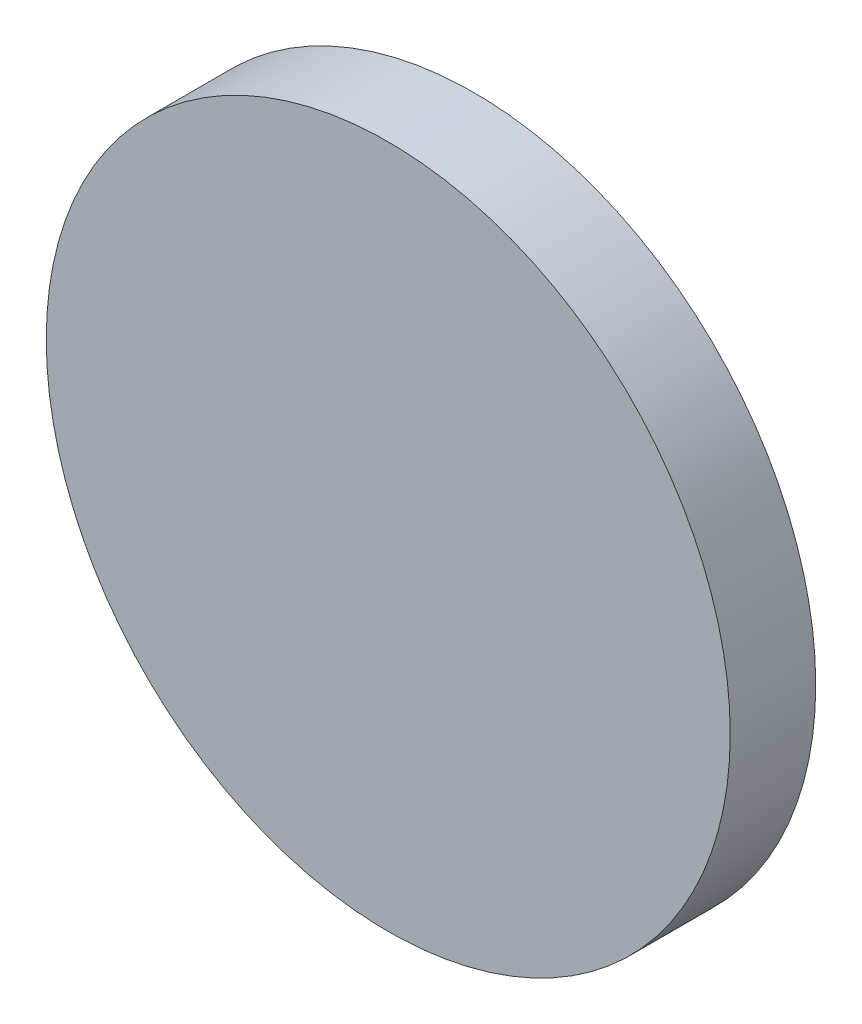
ISO-10303-21;
HEADER;
FILE_DESCRIPTION(('STEP AP214'),'2;1');
FILE_NAME('part.step','',(''),(''),'','','');
FILE_SCHEMA(('AUTOMOTIVE_DESIGN { 1 0 10303 214 1 1 1 1 }'));
ENDSEC;
DATA;
#1=APPLICATION_CONTEXT('core data for automotive mechanical design processes');
#2=APPLICATION_PROTOCOL_DEFINITION('international standard','automotive_design',2000,#1);
#3=PRODUCT_CONTEXT('',#1,'mechanical');
#4=PRODUCT('Part','Part','',(#3));
#5=PRODUCT_RELATED_PRODUCT_CATEGORY('part','',(#4));
#6=PRODUCT_DEFINITION_FORMATION('','',#4);
#7=PRODUCT_DEFINITION_CONTEXT('part definition',#1,'design');
#8=PRODUCT_DEFINITION('design','',#6,#7);
#9=PRODUCT_DEFINITION_SHAPE('','',#8);
#10=(LENGTH_UNIT() NAMED_UNIT(*) SI_UNIT(.MILLI.,.METRE.));
#11=(NAMED_UNIT(*) PLANE_ANGLE_UNIT() SI_UNIT($,.RADIAN.));
#12=(NAMED_UNIT(*) SI_UNIT($,.STERADIAN.) SOLID_ANGLE_UNIT());
#13=UNCERTAINTY_MEASURE_WITH_UNIT(LENGTH_MEASURE(1.E-05),#10,'distance_accuracy_value','');
#14=(GEOMETRIC_REPRESENTATION_CONTEXT(3) GLOBAL_UNCERTAINTY_ASSIGNED_CONTEXT((#13)) GLOBAL_UNIT_ASSIGNED_CONTEXT((#10,
#11,#12)) REPRESENTATION_CONTEXT('',''));
#15=CARTESIAN_POINT('',(0.,0.,0.));
#16=DIRECTION('',(0.,0.,1.));
#17=DIRECTION('',(1.,0.,0.));
#18=AXIS2_PLACEMENT_3D('',#15,#16,#17);
#19=CARTESIAN_POINT('',(0.,0.,-1.));
#20=DIRECTION('',(0.,0.,1.));
#21=DIRECTION('',(1.,0.,0.));
#22=AXIS2_PLACEMENT_3D('',#19,#20,#21);
#23=CYLINDRICAL_SURFACE('',#22,4.);
#24=CARTESIAN_POINT('',(0.,0.,-1.));
#25=DIRECTION('',(0.,0.,1.));
#26=DIRECTION('',(1.,0.,0.));
#27=AXIS2_PLACEMENT_3D('',#24,#25,#26);
#28=CIRCLE('',#27,4.);
#29=CARTESIAN_POINT('',(4.,0.,-1.));
#30=VERTEX_POINT('',#29);
#31=EDGE_CURVE('E10',#30,#30,#28,.T.);
#32=ORIENTED_EDGE('',*,*,#31,.T.);
#33=EDGE_LOOP('',(#32));
#34=FACE_BOUND('',#33,.T.);
#35=CARTESIAN_POINT('',(0.,0.,0.));
#36=DIRECTION('',(0.,0.,1.));
#37=DIRECTION('',(1.,0.,0.));
#38=AXIS2_PLACEMENT_3D('',#35,#36,#37);
#39=CIRCLE('',#38,4.);
#40=CARTESIAN_POINT('',(4.,0.,0.));
#41=VERTEX_POINT('',#40);
#42=EDGE_CURVE('E40',#41,#41,#39,.T.);
#43=ORIENTED_EDGE('',*,*,#42,.F.);
#44=EDGE_LOOP('',(#43));
#45=FACE_BOUND('',#44,.T.);
#46=ADVANCED_FACE('F37',(#34,#45),#23,.T.);
#47=CARTESIAN_POINT('',(0.,0.,-1.));
#48=DIRECTION('',(0.,0.,1.));
#49=DIRECTION('',(1.,0.,0.));
#50=AXIS2_PLACEMENT_3D('',#47,#48,#49);
#51=PLANE('',#50);
#52=ORIENTED_EDGE('',*,*,#31,.F.);
#53=EDGE_LOOP('',(#52));
#54=FACE_BOUND('',#53,.T.);
#55=ADVANCED_FACE('F54',(#54),#51,.F.);
#56=CARTESIAN_POINT('',(0.,0.,0.));
#57=DIRECTION('',(0.,0.,1.));
#58=DIRECTION('',(1.,0.,0.));
#59=AXIS2_PLACEMENT_3D('',#56,#57,#58);
#60=PLANE('',#59);
#61=ORIENTED_EDGE('',*,*,#42,.T.);
#62=EDGE_LOOP('',(#61));
#63=FACE_BOUND('',#62,.T.);
#64=ADVANCED_FACE('F51',(#63),#60,.T.);
#65=CLOSED_SHELL('',(#46,#55,#64));
#66=MANIFOLD_SOLID_BREP('B2',#65);
#67=ADVANCED_BREP_SHAPE_REPRESENTATION('',(#18,#66),#14);
#68=SHAPE_DEFINITION_REPRESENTATION(#9,#67);
ENDSEC;
END-ISO-10303-21;
